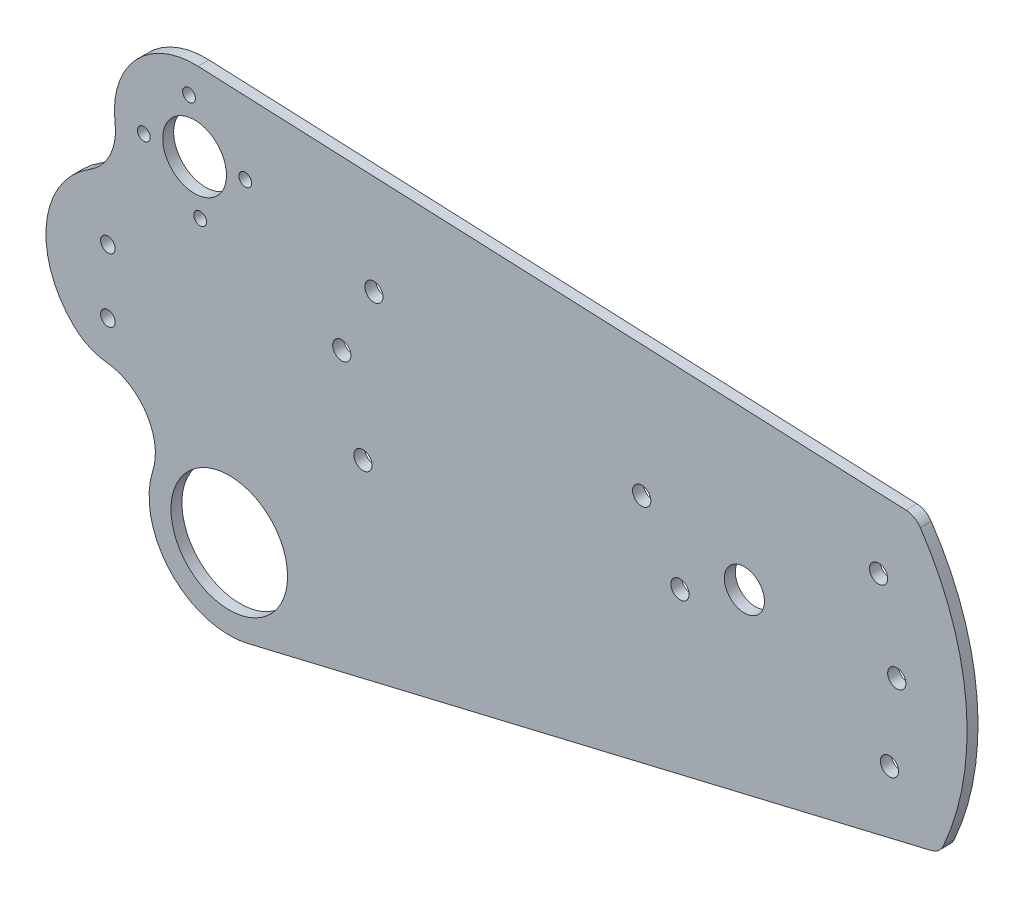
ISO-10303-21;
HEADER;
FILE_DESCRIPTION(('STEP AP214'),'2;1');
FILE_NAME('part.step','',(''),(''),'','','');
FILE_SCHEMA(('AUTOMOTIVE_DESIGN { 1 0 10303 214 1 1 1 1 }'));
ENDSEC;
DATA;
#1=APPLICATION_CONTEXT('core data for automotive mechanical design processes');
#2=APPLICATION_PROTOCOL_DEFINITION('international standard','automotive_design',2000,#1);
#3=PRODUCT_CONTEXT('',#1,'mechanical');
#4=PRODUCT('Part','Part','',(#3));
#5=PRODUCT_RELATED_PRODUCT_CATEGORY('part','',(#4));
#6=PRODUCT_DEFINITION_FORMATION('','',#4);
#7=PRODUCT_DEFINITION_CONTEXT('part definition',#1,'design');
#8=PRODUCT_DEFINITION('design','',#6,#7);
#9=PRODUCT_DEFINITION_SHAPE('','',#8);
#10=(LENGTH_UNIT() NAMED_UNIT(*) SI_UNIT(.MILLI.,.METRE.));
#11=(NAMED_UNIT(*) PLANE_ANGLE_UNIT() SI_UNIT($,.RADIAN.));
#12=(NAMED_UNIT(*) SI_UNIT($,.STERADIAN.) SOLID_ANGLE_UNIT());
#13=UNCERTAINTY_MEASURE_WITH_UNIT(LENGTH_MEASURE(1.E-05),#10,'distance_accuracy_value','');
#14=(GEOMETRIC_REPRESENTATION_CONTEXT(3) GLOBAL_UNCERTAINTY_ASSIGNED_CONTEXT((#13)) GLOBAL_UNIT_ASSIGNED_CONTEXT((#10,
#11,#12)) REPRESENTATION_CONTEXT('',''));
#15=CARTESIAN_POINT('',(0.,0.,0.));
#16=DIRECTION('',(0.,0.,1.));
#17=DIRECTION('',(1.,0.,0.));
#18=AXIS2_PLACEMENT_3D('',#15,#16,#17);
#19=CARTESIAN_POINT('',(1.91215632842237,44.5201547339827,3.));
#20=DIRECTION('',(0.0429107910239942,0.999078907801428,0.));
#21=DIRECTION('',(-0.999078907801428,0.0429107910239942,0.));
#22=AXIS2_PLACEMENT_3D('',#19,#20,#21);
#23=PLANE('',#22);
#24=DIRECTION('',(0.999078907801428,-0.0429107910239942,0.));
#25=VECTOR('',#24,1.);
#26=CARTESIAN_POINT('',(1.91215632842237,44.5201547339827,0.));
#27=LINE('',#26,#25);
#28=CARTESIAN_POINT('',(-113.560266524185,49.4797359716314,0.));
#29=VERTEX_POINT('',#28);
#30=CARTESIAN_POINT('',(80.7215881233943,41.1352618771054,0.));
#31=VERTEX_POINT('',#30);
#32=EDGE_CURVE('E195',#29,#31,#27,.T.);
#33=ORIENTED_EDGE('',*,*,#32,.F.);
#34=DIRECTION('',(0.,0.,-1.));
#35=VECTOR('',#34,1.);
#36=CARTESIAN_POINT('',(-113.560266524185,49.4797359716314,3.));
#37=LINE('',#36,#35);
#38=CARTESIAN_POINT('',(-113.560266524185,49.4797359716314,3.));
#39=VERTEX_POINT('',#38);
#40=EDGE_CURVE('E11',#39,#29,#37,.T.);
#41=ORIENTED_EDGE('',*,*,#40,.F.);
#42=DIRECTION('',(0.999078907801428,-0.0429107910239942,0.));
#43=VECTOR('',#42,1.);
#44=CARTESIAN_POINT('',(1.91215632842237,44.5201547339827,3.));
#45=LINE('',#44,#43);
#46=CARTESIAN_POINT('',(80.7215881233943,41.1352618771054,3.));
#47=VERTEX_POINT('',#46);
#48=EDGE_CURVE('E423',#39,#47,#45,.T.);
#49=ORIENTED_EDGE('',*,*,#48,.T.);
#50=DIRECTION('',(0.,0.,-1.));
#51=VECTOR('',#50,1.);
#52=CARTESIAN_POINT('',(80.7215881233943,41.1352618771054,3.));
#53=LINE('',#52,#51);
#54=EDGE_CURVE('E102',#47,#31,#53,.T.);
#55=ORIENTED_EDGE('',*,*,#54,.T.);
#56=EDGE_LOOP('',(#33,#41,#49,#55));
#57=FACE_BOUND('',#56,.T.);
#58=ADVANCED_FACE('F41',(#57),#23,.T.);
#59=CARTESIAN_POINT('',(-114.504303926713,27.5,3.));
#60=DIRECTION('',(0.,0.,-1.));
#61=DIRECTION('',(-1.,0.,0.));
#62=AXIS2_PLACEMENT_3D('',#59,#60,#61);
#63=CYLINDRICAL_SURFACE('',#62,22.);
#64=CARTESIAN_POINT('',(-114.504303926713,27.5,0.));
#65=DIRECTION('',(0.,0.,1.));
#66=DIRECTION('',(1.,0.,0.));
#67=AXIS2_PLACEMENT_3D('',#64,#65,#66);
#68=CIRCLE('',#67,22.);
#69=CARTESIAN_POINT('',(-136.329525130672,24.732380192604,0.));
#70=VERTEX_POINT('',#69);
#71=EDGE_CURVE('E192',#29,#70,#68,.T.);
#72=ORIENTED_EDGE('',*,*,#71,.T.);
#73=DIRECTION('',(0.,0.,-1.));
#74=VECTOR('',#73,1.);
#75=CARTESIAN_POINT('',(-136.329525130672,24.732380192604,3.));
#76=LINE('',#75,#74);
#77=CARTESIAN_POINT('',(-136.329525130672,24.732380192604,3.));
#78=VERTEX_POINT('',#77);
#79=EDGE_CURVE('E51',#78,#70,#76,.T.);
#80=ORIENTED_EDGE('',*,*,#79,.F.);
#81=CARTESIAN_POINT('',(-114.504303926713,27.5,3.));
#82=DIRECTION('',(0.,0.,1.));
#83=DIRECTION('',(1.,0.,0.));
#84=AXIS2_PLACEMENT_3D('',#81,#82,#83);
#85=CIRCLE('',#84,22.);
#86=EDGE_CURVE('E426',#39,#78,#85,.T.);
#87=ORIENTED_EDGE('',*,*,#86,.F.);
#88=ORIENTED_EDGE('',*,*,#40,.T.);
#89=EDGE_LOOP('',(#72,#80,#87,#88));
#90=FACE_BOUND('',#89,.T.);
#91=ADVANCED_FACE('F193',(#90),#63,.T.);
#92=CARTESIAN_POINT('',(-151.210357769734,22.8453666875613,3.));
#93=DIRECTION('',(0.,0.,-1.));
#94=DIRECTION('',(-1.,0.,0.));
#95=AXIS2_PLACEMENT_3D('',#92,#93,#94);
#96=CYLINDRICAL_SURFACE('',#95,15.);
#97=CARTESIAN_POINT('',(-151.210357769734,22.8453666875613,0.));
#98=DIRECTION('',(0.,0.,1.));
#99=DIRECTION('',(1.,0.,0.));
#100=AXIS2_PLACEMENT_3D('',#97,#98,#99);
#101=CIRCLE('',#100,15.);
#102=CARTESIAN_POINT('',(-143.370984404331,10.0569256082972,0.));
#103=VERTEX_POINT('',#102);
#104=EDGE_CURVE('E187',#103,#70,#101,.T.);
#105=ORIENTED_EDGE('',*,*,#104,.F.);
#106=DIRECTION('',(0.,0.,-1.));
#107=VECTOR('',#106,1.);
#108=CARTESIAN_POINT('',(-143.370984404331,10.0569256082972,3.));
#109=LINE('',#108,#107);
#110=CARTESIAN_POINT('',(-143.370984404331,10.0569256082972,3.));
#111=VERTEX_POINT('',#110);
#112=EDGE_CURVE('E177',#111,#103,#109,.T.);
#113=ORIENTED_EDGE('',*,*,#112,.F.);
#114=CARTESIAN_POINT('',(-151.210357769734,22.8453666875613,3.));
#115=DIRECTION('',(0.,0.,1.));
#116=DIRECTION('',(1.,0.,0.));
#117=AXIS2_PLACEMENT_3D('',#114,#115,#116);
#118=CIRCLE('',#117,15.);
#119=EDGE_CURVE('E189',#111,#78,#118,.T.);
#120=ORIENTED_EDGE('',*,*,#119,.T.);
#121=ORIENTED_EDGE('',*,*,#79,.T.);
#122=EDGE_LOOP('',(#105,#113,#120,#121));
#123=FACE_BOUND('',#122,.T.);
#124=ADVANCED_FACE('F185',(#123),#96,.F.);
#125=CARTESIAN_POINT('',(-130.305362128659,-11.2571428571429,3.));
#126=DIRECTION('',(0.,0.,-1.));
#127=DIRECTION('',(-1.,0.,0.));
#128=AXIS2_PLACEMENT_3D('',#125,#126,#127);
#129=CYLINDRICAL_SURFACE('',#128,25.);
#130=CARTESIAN_POINT('',(-130.305362128659,-11.2571428571429,0.));
#131=DIRECTION('',(0.,0.,1.));
#132=DIRECTION('',(1.,0.,0.));
#133=AXIS2_PLACEMENT_3D('',#130,#131,#132);
#134=CIRCLE('',#133,25.);
#135=CARTESIAN_POINT('',(-147.542861296201,-29.3642857142857,0.));
#136=VERTEX_POINT('',#135);
#137=EDGE_CURVE('E201',#103,#136,#134,.T.);
#138=ORIENTED_EDGE('',*,*,#137,.T.);
#139=DIRECTION('',(0.,0.,-1.));
#140=VECTOR('',#139,1.);
#141=CARTESIAN_POINT('',(-147.542861296201,-29.3642857142857,3.));
#142=LINE('',#141,#140);
#143=CARTESIAN_POINT('',(-147.542861296201,-29.3642857142857,3.));
#144=VERTEX_POINT('',#143);
#145=EDGE_CURVE('E173',#144,#136,#142,.T.);
#146=ORIENTED_EDGE('',*,*,#145,.F.);
#147=CARTESIAN_POINT('',(-130.305362128659,-11.2571428571429,3.));
#148=DIRECTION('',(0.,0.,1.));
#149=DIRECTION('',(1.,0.,0.));
#150=AXIS2_PLACEMENT_3D('',#147,#148,#149);
#151=CIRCLE('',#150,25.);
#152=EDGE_CURVE('E433',#111,#144,#151,.T.);
#153=ORIENTED_EDGE('',*,*,#152,.F.);
#154=ORIENTED_EDGE('',*,*,#112,.T.);
#155=EDGE_LOOP('',(#138,#146,#153,#154));
#156=FACE_BOUND('',#155,.T.);
#157=ADVANCED_FACE('F321',(#156),#129,.T.);
#158=CARTESIAN_POINT('',(-137.200361795676,-18.5,3.));
#159=DIRECTION('',(0.,0.,-1.));
#160=DIRECTION('',(-1.,0.,0.));
#161=AXIS2_PLACEMENT_3D('',#158,#159,#160);
#162=CYLINDRICAL_SURFACE('',#161,15.);
#163=CARTESIAN_POINT('',(-137.200361795676,-18.5,0.));
#164=DIRECTION('',(0.,0.,1.));
#165=DIRECTION('',(1.,0.,0.));
#166=AXIS2_PLACEMENT_3D('',#163,#164,#165);
#167=CIRCLE('',#166,15.);
#168=CARTESIAN_POINT('',(-138.735140925498,-33.4212751808505,0.));
#169=VERTEX_POINT('',#168);
#170=EDGE_CURVE('E205',#136,#169,#167,.T.);
#171=ORIENTED_EDGE('',*,*,#170,.T.);
#172=DIRECTION('',(0.,0.,-1.));
#173=VECTOR('',#172,1.);
#174=CARTESIAN_POINT('',(-138.735140925498,-33.4212751808505,3.));
#175=LINE('',#174,#173);
#176=CARTESIAN_POINT('',(-138.735140925498,-33.4212751808505,3.));
#177=VERTEX_POINT('',#176);
#178=EDGE_CURVE('E170',#177,#169,#175,.T.);
#179=ORIENTED_EDGE('',*,*,#178,.F.);
#180=CARTESIAN_POINT('',(-137.200361795676,-18.5,3.));
#181=DIRECTION('',(0.,0.,1.));
#182=DIRECTION('',(1.,0.,0.));
#183=AXIS2_PLACEMENT_3D('',#180,#181,#182);
#184=CIRCLE('',#183,15.);
#185=EDGE_CURVE('E437',#144,#177,#184,.T.);
#186=ORIENTED_EDGE('',*,*,#185,.F.);
#187=ORIENTED_EDGE('',*,*,#145,.T.);
#188=EDGE_LOOP('',(#171,#179,#186,#187));
#189=FACE_BOUND('',#188,.T.);
#190=ADVANCED_FACE('F324',(#189),#162,.T.);
#191=CARTESIAN_POINT('',(-140.26992005532,-48.3425503617009,3.));
#192=DIRECTION('',(0.,0.,-1.));
#193=DIRECTION('',(-1.,0.,0.));
#194=AXIS2_PLACEMENT_3D('',#191,#192,#193);
#195=CYLINDRICAL_SURFACE('',#194,15.);
#196=CARTESIAN_POINT('',(-140.26992005532,-48.3425503617009,0.));
#197=DIRECTION('',(0.,0.,1.));
#198=DIRECTION('',(1.,0.,0.));
#199=AXIS2_PLACEMENT_3D('',#196,#197,#198);
#200=CIRCLE('',#199,15.);
#201=CARTESIAN_POINT('',(-125.965715233565,-52.8580486085475,0.));
#202=VERTEX_POINT('',#201);
#203=EDGE_CURVE('E212',#202,#169,#200,.T.);
#204=ORIENTED_EDGE('',*,*,#203,.F.);
#205=DIRECTION('',(0.,0.,-1.));
#206=VECTOR('',#205,1.);
#207=CARTESIAN_POINT('',(-125.965715233565,-52.8580486085475,3.));
#208=LINE('',#207,#206);
#209=CARTESIAN_POINT('',(-125.965715233565,-52.8580486085475,3.));
#210=VERTEX_POINT('',#209);
#211=EDGE_CURVE('E167',#210,#202,#208,.T.);
#212=ORIENTED_EDGE('',*,*,#211,.F.);
#213=CARTESIAN_POINT('',(-140.26992005532,-48.3425503617009,3.));
#214=DIRECTION('',(0.,0.,1.));
#215=DIRECTION('',(1.,0.,0.));
#216=AXIS2_PLACEMENT_3D('',#213,#214,#215);
#217=CIRCLE('',#216,15.);
#218=EDGE_CURVE('E440',#210,#177,#217,.T.);
#219=ORIENTED_EDGE('',*,*,#218,.T.);
#220=ORIENTED_EDGE('',*,*,#178,.T.);
#221=EDGE_LOOP('',(#204,#212,#219,#220));
#222=FACE_BOUND('',#221,.T.);
#223=ADVANCED_FACE('F328',(#222),#195,.F.);
#224=CARTESIAN_POINT('',(-104.986214828324,-59.4807793705892,3.));
#225=DIRECTION('',(0.,0.,-1.));
#226=DIRECTION('',(-1.,0.,0.));
#227=AXIS2_PLACEMENT_3D('',#224,#225,#226);
#228=CYLINDRICAL_SURFACE('',#227,22.);
#229=CARTESIAN_POINT('',(-104.986214828324,-59.4807793705892,0.));
#230=DIRECTION('',(0.,0.,1.));
#231=DIRECTION('',(1.,0.,0.));
#232=AXIS2_PLACEMENT_3D('',#229,#230,#231);
#233=CIRCLE('',#232,22.);
#234=CARTESIAN_POINT('',(-99.8994420943231,-80.8846281635664,0.));
#235=VERTEX_POINT('',#234);
#236=EDGE_CURVE('E216',#202,#235,#233,.T.);
#237=ORIENTED_EDGE('',*,*,#236,.T.);
#238=DIRECTION('',(0.,0.,-1.));
#239=VECTOR('',#238,1.);
#240=CARTESIAN_POINT('',(-99.8994420943231,-80.8846281635664,3.));
#241=LINE('',#240,#239);
#242=CARTESIAN_POINT('',(-99.8994420943231,-80.8846281635664,3.));
#243=VERTEX_POINT('',#242);
#244=EDGE_CURVE('E159',#243,#235,#241,.T.);
#245=ORIENTED_EDGE('',*,*,#244,.F.);
#246=CARTESIAN_POINT('',(-104.986214828324,-59.4807793705892,3.));
#247=DIRECTION('',(0.,0.,1.));
#248=DIRECTION('',(1.,0.,0.));
#249=AXIS2_PLACEMENT_3D('',#246,#247,#248);
#250=CIRCLE('',#249,22.);
#251=EDGE_CURVE('E444',#210,#243,#250,.T.);
#252=ORIENTED_EDGE('',*,*,#251,.F.);
#253=ORIENTED_EDGE('',*,*,#211,.T.);
#254=EDGE_LOOP('',(#237,#245,#252,#253));
#255=FACE_BOUND('',#254,.T.);
#256=ADVANCED_FACE('F332',(#255),#228,.T.);
#257=CARTESIAN_POINT('',(12.8543650069219,-54.0879058934321,3.));
#258=DIRECTION('',(-0.231216942454566,0.972902217862598,0.));
#259=DIRECTION('',(-0.972902217862598,-0.231216942454566,0.));
#260=AXIS2_PLACEMENT_3D('',#257,#258,#259);
#261=PLANE('',#260);
#262=DIRECTION('',(0.972902217862598,0.231216942454566,0.));
#263=VECTOR('',#262,1.);
#264=CARTESIAN_POINT('',(12.8543650069219,-54.0879058934321,0.));
#265=LINE('',#264,#263);
#266=CARTESIAN_POINT('',(87.5903381718725,-36.3263848594582,0.));
#267=VERTEX_POINT('',#266);
#268=EDGE_CURVE('E220',#235,#267,#265,.T.);
#269=ORIENTED_EDGE('',*,*,#268,.T.);
#270=DIRECTION('',(0.,0.,-1.));
#271=VECTOR('',#270,1.);
#272=CARTESIAN_POINT('',(87.5903381718725,-36.3263848594582,3.));
#273=LINE('',#272,#271);
#274=CARTESIAN_POINT('',(87.5903381718725,-36.3263848594582,3.));
#275=VERTEX_POINT('',#274);
#276=EDGE_CURVE('E155',#275,#267,#273,.T.);
#277=ORIENTED_EDGE('',*,*,#276,.F.);
#278=DIRECTION('',(0.972902217862598,0.231216942454566,0.));
#279=VECTOR('',#278,1.);
#280=CARTESIAN_POINT('',(12.8543650069219,-54.0879058934321,3.));
#281=LINE('',#280,#279);
#282=EDGE_CURVE('E146',#243,#275,#281,.T.);
#283=ORIENTED_EDGE('',*,*,#282,.F.);
#284=ORIENTED_EDGE('',*,*,#244,.T.);
#285=EDGE_LOOP('',(#269,#277,#283,#284));
#286=FACE_BOUND('',#285,.T.);
#287=ADVANCED_FACE('F336',(#286),#261,.F.);
#288=CARTESIAN_POINT('',(86.4342534595996,-31.4618737701452,3.));
#289=DIRECTION('',(0.,0.,-1.));
#290=DIRECTION('',(-1.,0.,0.));
#291=AXIS2_PLACEMENT_3D('',#288,#289,#290);
#292=CYLINDRICAL_SURFACE('',#291,5.00000000000001);
#293=CARTESIAN_POINT('',(86.4342534595996,-31.4618737701452,0.));
#294=DIRECTION('',(0.,0.,1.));
#295=DIRECTION('',(1.,0.,0.));
#296=AXIS2_PLACEMENT_3D('',#293,#294,#295);
#297=CIRCLE('',#296,5.00000000000001);
#298=CARTESIAN_POINT('',(91.,-33.5,0.));
#299=VERTEX_POINT('',#298);
#300=EDGE_CURVE('E153',#267,#299,#297,.T.);
#301=ORIENTED_EDGE('',*,*,#300,.T.);
#302=DIRECTION('',(0.,0.,-1.));
#303=VECTOR('',#302,1.);
#304=CARTESIAN_POINT('',(91.,-33.5,3.));
#305=LINE('',#304,#303);
#306=CARTESIAN_POINT('',(91.,-33.5,3.));
#307=VERTEX_POINT('',#306);
#308=EDGE_CURVE('E136',#307,#299,#305,.T.);
#309=ORIENTED_EDGE('',*,*,#308,.F.);
#310=CARTESIAN_POINT('',(86.4342534595996,-31.4618737701452,3.));
#311=DIRECTION('',(0.,0.,1.));
#312=DIRECTION('',(1.,0.,0.));
#313=AXIS2_PLACEMENT_3D('',#310,#311,#312);
#314=CIRCLE('',#313,5.00000000000001);
#315=EDGE_CURVE('E140',#275,#307,#314,.T.);
#316=ORIENTED_EDGE('',*,*,#315,.F.);
#317=ORIENTED_EDGE('',*,*,#276,.T.);
#318=EDGE_LOOP('',(#301,#309,#316,#317));
#319=FACE_BOUND('',#318,.T.);
#320=ADVANCED_FACE('F152',(#319),#292,.T.);
#321=CARTESIAN_POINT('',(22.6589151875398,-2.99288439458776,3.));
#322=DIRECTION('',(0.,0.,-1.));
#323=DIRECTION('',(-1.,0.,0.));
#324=AXIS2_PLACEMENT_3D('',#321,#322,#323);
#325=CYLINDRICAL_SURFACE('',#324,74.8410848124603);
#326=CARTESIAN_POINT('',(22.6589151875398,-2.99288439458776,0.));
#327=DIRECTION('',(0.,0.,1.));
#328=DIRECTION('',(1.,0.,0.));
#329=AXIS2_PLACEMENT_3D('',#326,#327,#328);
#330=CIRCLE('',#329,74.8410848124603);
#331=CARTESIAN_POINT('',(84.648444567044,38.9414240319674,0.));
#332=VERTEX_POINT('',#331);
#333=EDGE_CURVE('E226',#299,#332,#330,.T.);
#334=ORIENTED_EDGE('',*,*,#333,.T.);
#335=DIRECTION('',(0.,0.,-1.));
#336=VECTOR('',#335,1.);
#337=CARTESIAN_POINT('',(84.648444567044,38.9414240319674,3.));
#338=LINE('',#337,#336);
#339=CARTESIAN_POINT('',(84.648444567044,38.9414240319674,3.));
#340=VERTEX_POINT('',#339);
#341=EDGE_CURVE('E138',#340,#332,#338,.T.);
#342=ORIENTED_EDGE('',*,*,#341,.F.);
#343=CARTESIAN_POINT('',(22.6589151875398,-2.99288439458776,3.));
#344=DIRECTION('',(0.,0.,1.));
#345=DIRECTION('',(1.,0.,0.));
#346=AXIS2_PLACEMENT_3D('',#343,#344,#345);
#347=CIRCLE('',#346,74.8410848124603);
#348=EDGE_CURVE('E131',#307,#340,#347,.T.);
#349=ORIENTED_EDGE('',*,*,#348,.F.);
#350=ORIENTED_EDGE('',*,*,#308,.T.);
#351=EDGE_LOOP('',(#334,#342,#349,#350));
#352=FACE_BOUND('',#351,.T.);
#353=ADVANCED_FACE('F134',(#352),#325,.T.);
#354=CARTESIAN_POINT('',(-100.587379227419,29.0228942557423,3.));
#355=DIRECTION('',(0.,0.,-1.));
#356=DIRECTION('',(-1.,0.,0.));
#357=AXIS2_PLACEMENT_3D('',#354,#355,#356);
#358=CYLINDRICAL_SURFACE('',#357,1.74999999999997);
#359=CARTESIAN_POINT('',(-100.587379227419,29.0228942557423,3.));
#360=DIRECTION('',(0.,0.,1.));
#361=DIRECTION('',(1.,0.,0.));
#362=AXIS2_PLACEMENT_3D('',#359,#360,#361);
#363=CIRCLE('',#362,1.74999999999997);
#364=CARTESIAN_POINT('',(-98.8373792274191,29.0228942557423,3.));
#365=VERTEX_POINT('',#364);
#366=EDGE_CURVE('E299',#365,#365,#363,.T.);
#367=ORIENTED_EDGE('',*,*,#366,.T.);
#368=EDGE_LOOP('',(#367));
#369=FACE_BOUND('',#368,.T.);
#370=CARTESIAN_POINT('',(-100.587379227419,29.0228942557423,0.));
#371=DIRECTION('',(0.,0.,1.));
#372=DIRECTION('',(1.,0.,0.));
#373=AXIS2_PLACEMENT_3D('',#370,#371,#372);
#374=CIRCLE('',#373,1.74999999999997);
#375=CARTESIAN_POINT('',(-98.8373792274191,29.0228942557423,0.));
#376=VERTEX_POINT('',#375);
#377=EDGE_CURVE('E287',#376,#376,#374,.T.);
#378=ORIENTED_EDGE('',*,*,#377,.F.);
#379=EDGE_LOOP('',(#378));
#380=FACE_BOUND('',#379,.T.);
#381=ADVANCED_FACE('F345',(#369,#380),#358,.F.);
#382=CARTESIAN_POINT('',(-112.981409670971,13.5830753007057,3.));
#383=DIRECTION('',(0.,0.,-1.));
#384=DIRECTION('',(-1.,0.,0.));
#385=AXIS2_PLACEMENT_3D('',#382,#383,#384);
#386=CYLINDRICAL_SURFACE('',#385,1.74999999999997);
#387=CARTESIAN_POINT('',(-112.981409670971,13.5830753007057,3.));
#388=DIRECTION('',(0.,0.,1.));
#389=DIRECTION('',(1.,0.,0.));
#390=AXIS2_PLACEMENT_3D('',#387,#388,#389);
#391=CIRCLE('',#390,1.74999999999997);
#392=CARTESIAN_POINT('',(-111.231409670971,13.5830753007057,3.));
#393=VERTEX_POINT('',#392);
#394=EDGE_CURVE('E305',#393,#393,#391,.T.);
#395=ORIENTED_EDGE('',*,*,#394,.T.);
#396=EDGE_LOOP('',(#395));
#397=FACE_BOUND('',#396,.T.);
#398=CARTESIAN_POINT('',(-112.981409670971,13.5830753007057,0.));
#399=DIRECTION('',(0.,0.,1.));
#400=DIRECTION('',(1.,0.,0.));
#401=AXIS2_PLACEMENT_3D('',#398,#399,#400);
#402=CIRCLE('',#401,1.74999999999997);
#403=CARTESIAN_POINT('',(-111.231409670971,13.5830753007057,0.));
#404=VERTEX_POINT('',#403);
#405=EDGE_CURVE('E283',#404,#404,#402,.T.);
#406=ORIENTED_EDGE('',*,*,#405,.F.);
#407=EDGE_LOOP('',(#406));
#408=FACE_BOUND('',#407,.T.);
#409=ADVANCED_FACE('F401',(#397,#408),#386,.F.);
#410=CARTESIAN_POINT('',(-128.421228626008,25.9771057442576,3.));
#411=DIRECTION('',(0.,0.,-1.));
#412=DIRECTION('',(-1.,0.,0.));
#413=AXIS2_PLACEMENT_3D('',#410,#411,#412);
#414=CYLINDRICAL_SURFACE('',#413,1.74999999999998);
#415=CARTESIAN_POINT('',(-128.421228626008,25.9771057442576,3.));
#416=DIRECTION('',(0.,0.,1.));
#417=DIRECTION('',(1.,0.,0.));
#418=AXIS2_PLACEMENT_3D('',#415,#416,#417);
#419=CIRCLE('',#418,1.74999999999998);
#420=CARTESIAN_POINT('',(-126.671228626008,25.9771057442576,3.));
#421=VERTEX_POINT('',#420);
#422=EDGE_CURVE('E499',#421,#421,#419,.T.);
#423=ORIENTED_EDGE('',*,*,#422,.T.);
#424=EDGE_LOOP('',(#423));
#425=FACE_BOUND('',#424,.T.);
#426=CARTESIAN_POINT('',(-128.421228626008,25.9771057442576,0.));
#427=DIRECTION('',(0.,0.,1.));
#428=DIRECTION('',(1.,0.,0.));
#429=AXIS2_PLACEMENT_3D('',#426,#427,#428);
#430=CIRCLE('',#429,1.74999999999998);
#431=CARTESIAN_POINT('',(-126.671228626008,25.9771057442576,0.));
#432=VERTEX_POINT('',#431);
#433=EDGE_CURVE('E279',#432,#432,#430,.T.);
#434=ORIENTED_EDGE('',*,*,#433,.F.);
#435=EDGE_LOOP('',(#434));
#436=FACE_BOUND('',#435,.T.);
#437=ADVANCED_FACE('F397',(#425,#436),#414,.F.);
#438=CARTESIAN_POINT('',(-114.504303926713,27.5,3.));
#439=DIRECTION('',(0.,0.,-1.));
#440=DIRECTION('',(-1.,0.,0.));
#441=AXIS2_PLACEMENT_3D('',#438,#439,#440);
#442=CYLINDRICAL_SURFACE('',#441,8.75);
#443=CARTESIAN_POINT('',(-114.504303926713,27.5,3.));
#444=DIRECTION('',(0.,0.,1.));
#445=DIRECTION('',(1.,0.,0.));
#446=AXIS2_PLACEMENT_3D('',#443,#444,#445);
#447=CIRCLE('',#446,8.75);
#448=CARTESIAN_POINT('',(-105.754303926713,27.5,3.));
#449=VERTEX_POINT('',#448);
#450=EDGE_CURVE('E495',#449,#449,#447,.T.);
#451=ORIENTED_EDGE('',*,*,#450,.T.);
#452=EDGE_LOOP('',(#451));
#453=FACE_BOUND('',#452,.T.);
#454=CARTESIAN_POINT('',(-114.504303926713,27.5,0.));
#455=DIRECTION('',(0.,0.,1.));
#456=DIRECTION('',(1.,0.,0.));
#457=AXIS2_PLACEMENT_3D('',#454,#455,#456);
#458=CIRCLE('',#457,8.75);
#459=CARTESIAN_POINT('',(-105.754303926713,27.5,0.));
#460=VERTEX_POINT('',#459);
#461=EDGE_CURVE('E275',#460,#460,#458,.T.);
#462=ORIENTED_EDGE('',*,*,#461,.F.);
#463=EDGE_LOOP('',(#462));
#464=FACE_BOUND('',#463,.T.);
#465=ADVANCED_FACE('F393',(#453,#464),#442,.F.);
#466=CARTESIAN_POINT('',(-104.986214828324,-59.4807793705892,3.));
#467=DIRECTION('',(0.,0.,-1.));
#468=DIRECTION('',(-1.,0.,0.));
#469=AXIS2_PLACEMENT_3D('',#466,#467,#468);
#470=CYLINDRICAL_SURFACE('',#469,16.);
#471=CARTESIAN_POINT('',(-104.986214828324,-59.4807793705892,3.));
#472=DIRECTION('',(0.,0.,1.));
#473=DIRECTION('',(1.,0.,0.));
#474=AXIS2_PLACEMENT_3D('',#471,#472,#473);
#475=CIRCLE('',#474,16.);
#476=CARTESIAN_POINT('',(-88.9862148283235,-59.4807793705892,3.));
#477=VERTEX_POINT('',#476);
#478=EDGE_CURVE('E491',#477,#477,#475,.T.);
#479=ORIENTED_EDGE('',*,*,#478,.T.);
#480=EDGE_LOOP('',(#479));
#481=FACE_BOUND('',#480,.T.);
#482=CARTESIAN_POINT('',(-104.986214828324,-59.4807793705892,0.));
#483=DIRECTION('',(0.,0.,1.));
#484=DIRECTION('',(1.,0.,0.));
#485=AXIS2_PLACEMENT_3D('',#482,#483,#484);
#486=CIRCLE('',#485,16.);
#487=CARTESIAN_POINT('',(-88.9862148283235,-59.4807793705892,0.));
#488=VERTEX_POINT('',#487);
#489=EDGE_CURVE('E271',#488,#488,#486,.T.);
#490=ORIENTED_EDGE('',*,*,#489,.F.);
#491=EDGE_LOOP('',(#490));
#492=FACE_BOUND('',#491,.T.);
#493=ADVANCED_FACE('F389',(#481,#492),#470,.F.);
#494=CARTESIAN_POINT('',(-68.3,-21.5,3.));
#495=DIRECTION('',(0.,0.,-1.));
#496=DIRECTION('',(-1.,0.,0.));
#497=AXIS2_PLACEMENT_3D('',#494,#495,#496);
#498=CYLINDRICAL_SURFACE('',#497,2.49999999999999);
#499=CARTESIAN_POINT('',(-68.3,-21.5,3.));
#500=DIRECTION('',(0.,0.,1.));
#501=DIRECTION('',(1.,0.,0.));
#502=AXIS2_PLACEMENT_3D('',#499,#500,#501);
#503=CIRCLE('',#502,2.49999999999999);
#504=CARTESIAN_POINT('',(-65.8,-21.5,3.));
#505=VERTEX_POINT('',#504);
#506=EDGE_CURVE('E487',#505,#505,#503,.T.);
#507=ORIENTED_EDGE('',*,*,#506,.T.);
#508=EDGE_LOOP('',(#507));
#509=FACE_BOUND('',#508,.T.);
#510=CARTESIAN_POINT('',(-68.3,-21.5,0.));
#511=DIRECTION('',(0.,0.,1.));
#512=DIRECTION('',(1.,0.,0.));
#513=AXIS2_PLACEMENT_3D('',#510,#511,#512);
#514=CIRCLE('',#513,2.49999999999999);
#515=CARTESIAN_POINT('',(-65.8,-21.5,0.));
#516=VERTEX_POINT('',#515);
#517=EDGE_CURVE('E267',#516,#516,#514,.T.);
#518=ORIENTED_EDGE('',*,*,#517,.F.);
#519=EDGE_LOOP('',(#518));
#520=FACE_BOUND('',#519,.T.);
#521=ADVANCED_FACE('F385',(#509,#520),#498,.F.);
#522=CARTESIAN_POINT('',(-138.3,-5.25000000000004,3.));
#523=DIRECTION('',(0.,0.,-1.));
#524=DIRECTION('',(-1.,0.,0.));
#525=AXIS2_PLACEMENT_3D('',#522,#523,#524);
#526=CYLINDRICAL_SURFACE('',#525,2.);
#527=CARTESIAN_POINT('',(-138.3,-5.25000000000004,3.));
#528=DIRECTION('',(0.,0.,1.));
#529=DIRECTION('',(1.,0.,0.));
#530=AXIS2_PLACEMENT_3D('',#527,#528,#529);
#531=CIRCLE('',#530,2.);
#532=CARTESIAN_POINT('',(-136.3,-5.25000000000004,3.));
#533=VERTEX_POINT('',#532);
#534=EDGE_CURVE('E483',#533,#533,#531,.T.);
#535=ORIENTED_EDGE('',*,*,#534,.T.);
#536=EDGE_LOOP('',(#535));
#537=FACE_BOUND('',#536,.T.);
#538=CARTESIAN_POINT('',(-138.3,-5.25000000000004,0.));
#539=DIRECTION('',(0.,0.,1.));
#540=DIRECTION('',(1.,0.,0.));
#541=AXIS2_PLACEMENT_3D('',#538,#539,#540);
#542=CIRCLE('',#541,2.);
#543=CARTESIAN_POINT('',(-136.3,-5.25000000000004,0.));
#544=VERTEX_POINT('',#543);
#545=EDGE_CURVE('E263',#544,#544,#542,.T.);
#546=ORIENTED_EDGE('',*,*,#545,.F.);
#547=EDGE_LOOP('',(#546));
#548=FACE_BOUND('',#547,.T.);
#549=ADVANCED_FACE('F381',(#537,#548),#526,.F.);
#550=CARTESIAN_POINT('',(-138.3,-22.75,3.));
#551=DIRECTION('',(0.,0.,-1.));
#552=DIRECTION('',(-1.,0.,0.));
#553=AXIS2_PLACEMENT_3D('',#550,#551,#552);
#554=CYLINDRICAL_SURFACE('',#553,2.);
#555=CARTESIAN_POINT('',(-138.3,-22.75,3.));
#556=DIRECTION('',(0.,0.,1.));
#557=DIRECTION('',(1.,0.,0.));
#558=AXIS2_PLACEMENT_3D('',#555,#556,#557);
#559=CIRCLE('',#558,2.);
#560=CARTESIAN_POINT('',(-136.3,-22.75,3.));
#561=VERTEX_POINT('',#560);
#562=EDGE_CURVE('E479',#561,#561,#559,.T.);
#563=ORIENTED_EDGE('',*,*,#562,.T.);
#564=EDGE_LOOP('',(#563));
#565=FACE_BOUND('',#564,.T.);
#566=CARTESIAN_POINT('',(-138.3,-22.75,0.));
#567=DIRECTION('',(0.,0.,1.));
#568=DIRECTION('',(1.,0.,0.));
#569=AXIS2_PLACEMENT_3D('',#566,#567,#568);
#570=CIRCLE('',#569,2.);
#571=CARTESIAN_POINT('',(-136.3,-22.75,0.));
#572=VERTEX_POINT('',#571);
#573=EDGE_CURVE('E259',#572,#572,#570,.T.);
#574=ORIENTED_EDGE('',*,*,#573,.F.);
#575=EDGE_LOOP('',(#574));
#576=FACE_BOUND('',#575,.T.);
#577=ADVANCED_FACE('F377',(#565,#576),#554,.F.);
#578=CARTESIAN_POINT('',(-74.1,1.7,3.));
#579=DIRECTION('',(0.,0.,-1.));
#580=DIRECTION('',(-1.,0.,0.));
#581=AXIS2_PLACEMENT_3D('',#578,#579,#580);
#582=CYLINDRICAL_SURFACE('',#581,2.49999999999999);
#583=CARTESIAN_POINT('',(-74.1,1.7,3.));
#584=DIRECTION('',(0.,0.,1.));
#585=DIRECTION('',(1.,0.,0.));
#586=AXIS2_PLACEMENT_3D('',#583,#584,#585);
#587=CIRCLE('',#586,2.49999999999999);
#588=CARTESIAN_POINT('',(-71.6,1.7,3.));
#589=VERTEX_POINT('',#588);
#590=EDGE_CURVE('E475',#589,#589,#587,.T.);
#591=ORIENTED_EDGE('',*,*,#590,.T.);
#592=EDGE_LOOP('',(#591));
#593=FACE_BOUND('',#592,.T.);
#594=CARTESIAN_POINT('',(-74.1,1.7,0.));
#595=DIRECTION('',(0.,0.,1.));
#596=DIRECTION('',(1.,0.,0.));
#597=AXIS2_PLACEMENT_3D('',#594,#595,#596);
#598=CIRCLE('',#597,2.49999999999999);
#599=CARTESIAN_POINT('',(-71.6,1.7,0.));
#600=VERTEX_POINT('',#599);
#601=EDGE_CURVE('E255',#600,#600,#598,.T.);
#602=ORIENTED_EDGE('',*,*,#601,.F.);
#603=EDGE_LOOP('',(#602));
#604=FACE_BOUND('',#603,.T.);
#605=ADVANCED_FACE('F373',(#593,#604),#582,.F.);
#606=CARTESIAN_POINT('',(-65.3,20.,3.));
#607=DIRECTION('',(0.,0.,-1.));
#608=DIRECTION('',(-1.,0.,0.));
#609=AXIS2_PLACEMENT_3D('',#606,#607,#608);
#610=CYLINDRICAL_SURFACE('',#609,2.50000000000001);
#611=CARTESIAN_POINT('',(-65.3,20.,3.));
#612=DIRECTION('',(0.,0.,1.));
#613=DIRECTION('',(1.,0.,0.));
#614=AXIS2_PLACEMENT_3D('',#611,#612,#613);
#615=CIRCLE('',#614,2.50000000000001);
#616=CARTESIAN_POINT('',(-62.8,20.,3.));
#617=VERTEX_POINT('',#616);
#618=EDGE_CURVE('E471',#617,#617,#615,.T.);
#619=ORIENTED_EDGE('',*,*,#618,.T.);
#620=EDGE_LOOP('',(#619));
#621=FACE_BOUND('',#620,.T.);
#622=CARTESIAN_POINT('',(-65.3,20.,0.));
#623=DIRECTION('',(0.,0.,1.));
#624=DIRECTION('',(1.,0.,0.));
#625=AXIS2_PLACEMENT_3D('',#622,#623,#624);
#626=CIRCLE('',#625,2.50000000000001);
#627=CARTESIAN_POINT('',(-62.8,20.,0.));
#628=VERTEX_POINT('',#627);
#629=EDGE_CURVE('E251',#628,#628,#626,.T.);
#630=ORIENTED_EDGE('',*,*,#629,.F.);
#631=EDGE_LOOP('',(#630));
#632=FACE_BOUND('',#631,.T.);
#633=ADVANCED_FACE('F369',(#621,#632),#610,.F.);
#634=CARTESIAN_POINT('',(78.2,-0.100000000000003,3.));
#635=DIRECTION('',(0.,0.,-1.));
#636=DIRECTION('',(-1.,0.,0.));
#637=AXIS2_PLACEMENT_3D('',#634,#635,#636);
#638=CYLINDRICAL_SURFACE('',#637,2.5);
#639=CARTESIAN_POINT('',(78.2,-0.100000000000003,3.));
#640=DIRECTION('',(0.,0.,1.));
#641=DIRECTION('',(1.,0.,0.));
#642=AXIS2_PLACEMENT_3D('',#639,#640,#641);
#643=CIRCLE('',#642,2.5);
#644=CARTESIAN_POINT('',(80.7,-0.100000000000003,3.));
#645=VERTEX_POINT('',#644);
#646=EDGE_CURVE('E467',#645,#645,#643,.T.);
#647=ORIENTED_EDGE('',*,*,#646,.T.);
#648=EDGE_LOOP('',(#647));
#649=FACE_BOUND('',#648,.T.);
#650=CARTESIAN_POINT('',(78.2,-0.100000000000003,0.));
#651=DIRECTION('',(0.,0.,1.));
#652=DIRECTION('',(1.,0.,0.));
#653=AXIS2_PLACEMENT_3D('',#650,#651,#652);
#654=CIRCLE('',#653,2.5);
#655=CARTESIAN_POINT('',(80.7,-0.100000000000003,0.));
#656=VERTEX_POINT('',#655);
#657=EDGE_CURVE('E247',#656,#656,#654,.T.);
#658=ORIENTED_EDGE('',*,*,#657,.F.);
#659=EDGE_LOOP('',(#658));
#660=FACE_BOUND('',#659,.T.);
#661=ADVANCED_FACE('F365',(#649,#660),#638,.F.);
#662=CARTESIAN_POINT('',(18.7,-8.7,3.));
#663=DIRECTION('',(0.,0.,-1.));
#664=DIRECTION('',(-1.,0.,0.));
#665=AXIS2_PLACEMENT_3D('',#662,#663,#664);
#666=CYLINDRICAL_SURFACE('',#665,2.5);
#667=CARTESIAN_POINT('',(18.7,-8.7,3.));
#668=DIRECTION('',(0.,0.,1.));
#669=DIRECTION('',(1.,0.,0.));
#670=AXIS2_PLACEMENT_3D('',#667,#668,#669);
#671=CIRCLE('',#670,2.5);
#672=CARTESIAN_POINT('',(21.2,-8.7,3.));
#673=VERTEX_POINT('',#672);
#674=EDGE_CURVE('E463',#673,#673,#671,.T.);
#675=ORIENTED_EDGE('',*,*,#674,.T.);
#676=EDGE_LOOP('',(#675));
#677=FACE_BOUND('',#676,.T.);
#678=CARTESIAN_POINT('',(18.7,-8.7,0.));
#679=DIRECTION('',(0.,0.,1.));
#680=DIRECTION('',(1.,0.,0.));
#681=AXIS2_PLACEMENT_3D('',#678,#679,#680);
#682=CIRCLE('',#681,2.5);
#683=CARTESIAN_POINT('',(21.2,-8.7,0.));
#684=VERTEX_POINT('',#683);
#685=EDGE_CURVE('E243',#684,#684,#682,.T.);
#686=ORIENTED_EDGE('',*,*,#685,.F.);
#687=EDGE_LOOP('',(#686));
#688=FACE_BOUND('',#687,.T.);
#689=ADVANCED_FACE('F361',(#677,#688),#666,.F.);
#690=CARTESIAN_POINT('',(8.20000000000003,8.3,3.));
#691=DIRECTION('',(0.,0.,-1.));
#692=DIRECTION('',(-1.,0.,0.));
#693=AXIS2_PLACEMENT_3D('',#690,#691,#692);
#694=CYLINDRICAL_SURFACE('',#693,2.5);
#695=CARTESIAN_POINT('',(8.20000000000003,8.3,3.));
#696=DIRECTION('',(0.,0.,1.));
#697=DIRECTION('',(1.,0.,0.));
#698=AXIS2_PLACEMENT_3D('',#695,#696,#697);
#699=CIRCLE('',#698,2.5);
#700=CARTESIAN_POINT('',(10.7,8.3,3.));
#701=VERTEX_POINT('',#700);
#702=EDGE_CURVE('E459',#701,#701,#699,.T.);
#703=ORIENTED_EDGE('',*,*,#702,.T.);
#704=EDGE_LOOP('',(#703));
#705=FACE_BOUND('',#704,.T.);
#706=CARTESIAN_POINT('',(8.20000000000003,8.3,0.));
#707=DIRECTION('',(0.,0.,1.));
#708=DIRECTION('',(1.,0.,0.));
#709=AXIS2_PLACEMENT_3D('',#706,#707,#708);
#710=CIRCLE('',#709,2.5);
#711=CARTESIAN_POINT('',(10.7,8.3,0.));
#712=VERTEX_POINT('',#711);
#713=EDGE_CURVE('E239',#712,#712,#710,.T.);
#714=ORIENTED_EDGE('',*,*,#713,.F.);
#715=EDGE_LOOP('',(#714));
#716=FACE_BOUND('',#715,.T.);
#717=ADVANCED_FACE('F357',(#705,#716),#694,.F.);
#718=CARTESIAN_POINT('',(36.3824499650715,0.,3.));
#719=DIRECTION('',(0.,0.,-1.));
#720=DIRECTION('',(-1.,0.,0.));
#721=AXIS2_PLACEMENT_3D('',#718,#719,#720);
#722=CYLINDRICAL_SURFACE('',#721,5.5);
#723=CARTESIAN_POINT('',(36.3824499650715,0.,3.));
#724=DIRECTION('',(0.,0.,1.));
#725=DIRECTION('',(1.,0.,0.));
#726=AXIS2_PLACEMENT_3D('',#723,#724,#725);
#727=CIRCLE('',#726,5.5);
#728=CARTESIAN_POINT('',(41.8824499650715,0.,3.));
#729=VERTEX_POINT('',#728);
#730=EDGE_CURVE('E455',#729,#729,#727,.T.);
#731=ORIENTED_EDGE('',*,*,#730,.T.);
#732=EDGE_LOOP('',(#731));
#733=FACE_BOUND('',#732,.T.);
#734=CARTESIAN_POINT('',(36.3824499650715,0.,0.));
#735=DIRECTION('',(0.,0.,1.));
#736=DIRECTION('',(1.,0.,0.));
#737=AXIS2_PLACEMENT_3D('',#734,#735,#736);
#738=CIRCLE('',#737,5.5);
#739=CARTESIAN_POINT('',(41.8824499650715,0.,0.));
#740=VERTEX_POINT('',#739);
#741=EDGE_CURVE('E235',#740,#740,#738,.T.);
#742=ORIENTED_EDGE('',*,*,#741,.F.);
#743=EDGE_LOOP('',(#742));
#744=FACE_BOUND('',#743,.T.);
#745=ADVANCED_FACE('F353',(#733,#744),#722,.F.);
#746=CARTESIAN_POINT('',(76.2,-22.,3.));
#747=DIRECTION('',(0.,0.,-1.));
#748=DIRECTION('',(-1.,0.,0.));
#749=AXIS2_PLACEMENT_3D('',#746,#747,#748);
#750=CYLINDRICAL_SURFACE('',#749,2.5);
#751=CARTESIAN_POINT('',(76.2,-22.,3.));
#752=DIRECTION('',(0.,0.,1.));
#753=DIRECTION('',(1.,0.,0.));
#754=AXIS2_PLACEMENT_3D('',#751,#752,#753);
#755=CIRCLE('',#754,2.5);
#756=CARTESIAN_POINT('',(78.7,-22.,3.));
#757=VERTEX_POINT('',#756);
#758=EDGE_CURVE('E451',#757,#757,#755,.T.);
#759=ORIENTED_EDGE('',*,*,#758,.T.);
#760=EDGE_LOOP('',(#759));
#761=FACE_BOUND('',#760,.T.);
#762=CARTESIAN_POINT('',(76.2,-22.,0.));
#763=DIRECTION('',(0.,0.,1.));
#764=DIRECTION('',(1.,0.,0.));
#765=AXIS2_PLACEMENT_3D('',#762,#763,#764);
#766=CIRCLE('',#765,2.5);
#767=CARTESIAN_POINT('',(78.7,-22.,0.));
#768=VERTEX_POINT('',#767);
#769=EDGE_CURVE('E231',#768,#768,#766,.T.);
#770=ORIENTED_EDGE('',*,*,#769,.F.);
#771=EDGE_LOOP('',(#770));
#772=FACE_BOUND('',#771,.T.);
#773=ADVANCED_FACE('F349',(#761,#772),#750,.F.);
#774=CARTESIAN_POINT('',(80.5070341682744,36.1398673380983,3.));
#775=DIRECTION('',(0.,0.,-1.));
#776=DIRECTION('',(-1.,0.,0.));
#777=AXIS2_PLACEMENT_3D('',#774,#775,#776);
#778=CYLINDRICAL_SURFACE('',#777,5.00000000000002);
#779=CARTESIAN_POINT('',(80.5070341682744,36.1398673380983,0.));
#780=DIRECTION('',(0.,0.,1.));
#781=DIRECTION('',(1.,0.,0.));
#782=AXIS2_PLACEMENT_3D('',#779,#780,#781);
#783=CIRCLE('',#782,5.00000000000002);
#784=EDGE_CURVE('E95',#332,#31,#783,.T.);
#785=ORIENTED_EDGE('',*,*,#784,.T.);
#786=ORIENTED_EDGE('',*,*,#54,.F.);
#787=CARTESIAN_POINT('',(80.5070341682744,36.1398673380983,3.));
#788=DIRECTION('',(0.,0.,1.));
#789=DIRECTION('',(1.,0.,0.));
#790=AXIS2_PLACEMENT_3D('',#787,#788,#789);
#791=CIRCLE('',#790,5.00000000000002);
#792=EDGE_CURVE('E59',#340,#47,#791,.T.);
#793=ORIENTED_EDGE('',*,*,#792,.F.);
#794=ORIENTED_EDGE('',*,*,#341,.T.);
#795=EDGE_LOOP('',(#785,#786,#793,#794));
#796=FACE_BOUND('',#795,.T.);
#797=ADVANCED_FACE('F346',(#796),#778,.T.);
#798=CARTESIAN_POINT('',(73.2,22.3,3.));
#799=DIRECTION('',(0.,0.,-1.));
#800=DIRECTION('',(-1.,0.,0.));
#801=AXIS2_PLACEMENT_3D('',#798,#799,#800);
#802=CYLINDRICAL_SURFACE('',#801,2.50000000000001);
#803=CARTESIAN_POINT('',(73.2,22.3,3.));
#804=DIRECTION('',(0.,0.,1.));
#805=DIRECTION('',(1.,0.,0.));
#806=AXIS2_PLACEMENT_3D('',#803,#804,#805);
#807=CIRCLE('',#806,2.50000000000001);
#808=CARTESIAN_POINT('',(75.7000000000001,22.3,3.));
#809=VERTEX_POINT('',#808);
#810=EDGE_CURVE('E294',#809,#809,#807,.T.);
#811=ORIENTED_EDGE('',*,*,#810,.T.);
#812=EDGE_LOOP('',(#811));
#813=FACE_BOUND('',#812,.T.);
#814=CARTESIAN_POINT('',(73.2,22.3,0.));
#815=DIRECTION('',(0.,0.,1.));
#816=DIRECTION('',(1.,0.,0.));
#817=AXIS2_PLACEMENT_3D('',#814,#815,#816);
#818=CIRCLE('',#817,2.50000000000001);
#819=CARTESIAN_POINT('',(75.7000000000001,22.3,0.));
#820=VERTEX_POINT('',#819);
#821=EDGE_CURVE('E309',#820,#820,#818,.T.);
#822=ORIENTED_EDGE('',*,*,#821,.F.);
#823=EDGE_LOOP('',(#822));
#824=FACE_BOUND('',#823,.T.);
#825=ADVANCED_FACE('F43',(#813,#824),#802,.F.);
#826=CARTESIAN_POINT('',(-116.027198182456,41.4169246992942,3.));
#827=DIRECTION('',(0.,0.,-1.));
#828=DIRECTION('',(-1.,0.,0.));
#829=AXIS2_PLACEMENT_3D('',#826,#827,#828);
#830=CYLINDRICAL_SURFACE('',#829,1.75);
#831=CARTESIAN_POINT('',(-116.027198182456,41.4169246992942,3.));
#832=DIRECTION('',(0.,0.,1.));
#833=DIRECTION('',(1.,0.,0.));
#834=AXIS2_PLACEMENT_3D('',#831,#832,#833);
#835=CIRCLE('',#834,1.75);
#836=CARTESIAN_POINT('',(-114.277198182456,41.4169246992942,3.));
#837=VERTEX_POINT('',#836);
#838=EDGE_CURVE('E296',#837,#837,#835,.T.);
#839=ORIENTED_EDGE('',*,*,#838,.T.);
#840=EDGE_LOOP('',(#839));
#841=FACE_BOUND('',#840,.T.);
#842=CARTESIAN_POINT('',(-116.027198182456,41.4169246992942,0.));
#843=DIRECTION('',(0.,0.,1.));
#844=DIRECTION('',(1.,0.,0.));
#845=AXIS2_PLACEMENT_3D('',#842,#843,#844);
#846=CIRCLE('',#845,1.75);
#847=CARTESIAN_POINT('',(-114.277198182456,41.4169246992942,0.));
#848=VERTEX_POINT('',#847);
#849=EDGE_CURVE('E291',#848,#848,#846,.T.);
#850=ORIENTED_EDGE('',*,*,#849,.F.);
#851=EDGE_LOOP('',(#850));
#852=FACE_BOUND('',#851,.T.);
#853=ADVANCED_FACE('F409',(#841,#852),#830,.F.);
#854=CARTESIAN_POINT('',(0.,0.,3.));
#855=DIRECTION('',(0.,0.,1.));
#856=DIRECTION('',(1.,0.,0.));
#857=AXIS2_PLACEMENT_3D('',#854,#855,#856);
#858=PLANE('',#857);
#859=ORIENTED_EDGE('',*,*,#810,.F.);
#860=EDGE_LOOP('',(#859));
#861=FACE_BOUND('',#860,.T.);
#862=ORIENTED_EDGE('',*,*,#48,.F.);
#863=ORIENTED_EDGE('',*,*,#86,.T.);
#864=ORIENTED_EDGE('',*,*,#119,.F.);
#865=ORIENTED_EDGE('',*,*,#152,.T.);
#866=ORIENTED_EDGE('',*,*,#185,.T.);
#867=ORIENTED_EDGE('',*,*,#218,.F.);
#868=ORIENTED_EDGE('',*,*,#251,.T.);
#869=ORIENTED_EDGE('',*,*,#282,.T.);
#870=ORIENTED_EDGE('',*,*,#315,.T.);
#871=ORIENTED_EDGE('',*,*,#348,.T.);
#872=ORIENTED_EDGE('',*,*,#792,.T.);
#873=EDGE_LOOP('',(#862,#863,#864,#865,#866,#867,#868,#869,#870,#871,#872));
#874=FACE_BOUND('',#873,.T.);
#875=ORIENTED_EDGE('',*,*,#758,.F.);
#876=EDGE_LOOP('',(#875));
#877=FACE_BOUND('',#876,.T.);
#878=ORIENTED_EDGE('',*,*,#730,.F.);
#879=EDGE_LOOP('',(#878));
#880=FACE_BOUND('',#879,.T.);
#881=ORIENTED_EDGE('',*,*,#702,.F.);
#882=EDGE_LOOP('',(#881));
#883=FACE_BOUND('',#882,.T.);
#884=ORIENTED_EDGE('',*,*,#674,.F.);
#885=EDGE_LOOP('',(#884));
#886=FACE_BOUND('',#885,.T.);
#887=ORIENTED_EDGE('',*,*,#646,.F.);
#888=EDGE_LOOP('',(#887));
#889=FACE_BOUND('',#888,.T.);
#890=ORIENTED_EDGE('',*,*,#618,.F.);
#891=EDGE_LOOP('',(#890));
#892=FACE_BOUND('',#891,.T.);
#893=ORIENTED_EDGE('',*,*,#590,.F.);
#894=EDGE_LOOP('',(#893));
#895=FACE_BOUND('',#894,.T.);
#896=ORIENTED_EDGE('',*,*,#562,.F.);
#897=EDGE_LOOP('',(#896));
#898=FACE_BOUND('',#897,.T.);
#899=ORIENTED_EDGE('',*,*,#534,.F.);
#900=EDGE_LOOP('',(#899));
#901=FACE_BOUND('',#900,.T.);
#902=ORIENTED_EDGE('',*,*,#506,.F.);
#903=EDGE_LOOP('',(#902));
#904=FACE_BOUND('',#903,.T.);
#905=ORIENTED_EDGE('',*,*,#478,.F.);
#906=EDGE_LOOP('',(#905));
#907=FACE_BOUND('',#906,.T.);
#908=ORIENTED_EDGE('',*,*,#450,.F.);
#909=EDGE_LOOP('',(#908));
#910=FACE_BOUND('',#909,.T.);
#911=ORIENTED_EDGE('',*,*,#422,.F.);
#912=EDGE_LOOP('',(#911));
#913=FACE_BOUND('',#912,.T.);
#914=ORIENTED_EDGE('',*,*,#394,.F.);
#915=EDGE_LOOP('',(#914));
#916=FACE_BOUND('',#915,.T.);
#917=ORIENTED_EDGE('',*,*,#366,.F.);
#918=EDGE_LOOP('',(#917));
#919=FACE_BOUND('',#918,.T.);
#920=ORIENTED_EDGE('',*,*,#838,.F.);
#921=EDGE_LOOP('',(#920));
#922=FACE_BOUND('',#921,.T.);
#923=ADVANCED_FACE('F143',(#861,#874,#877,#880,#883,#886,#889,#892,#895,#898,#901,#904,#907,
#910,#913,#916,#919,#922),#858,.T.);
#924=CARTESIAN_POINT('',(0.,0.,0.));
#925=DIRECTION('',(0.,0.,1.));
#926=DIRECTION('',(1.,0.,0.));
#927=AXIS2_PLACEMENT_3D('',#924,#925,#926);
#928=PLANE('',#927);
#929=ORIENTED_EDGE('',*,*,#821,.T.);
#930=EDGE_LOOP('',(#929));
#931=FACE_BOUND('',#930,.T.);
#932=ORIENTED_EDGE('',*,*,#32,.T.);
#933=ORIENTED_EDGE('',*,*,#784,.F.);
#934=ORIENTED_EDGE('',*,*,#333,.F.);
#935=ORIENTED_EDGE('',*,*,#300,.F.);
#936=ORIENTED_EDGE('',*,*,#268,.F.);
#937=ORIENTED_EDGE('',*,*,#236,.F.);
#938=ORIENTED_EDGE('',*,*,#203,.T.);
#939=ORIENTED_EDGE('',*,*,#170,.F.);
#940=ORIENTED_EDGE('',*,*,#137,.F.);
#941=ORIENTED_EDGE('',*,*,#104,.T.);
#942=ORIENTED_EDGE('',*,*,#71,.F.);
#943=EDGE_LOOP('',(#932,#933,#934,#935,#936,#937,#938,#939,#940,#941,#942));
#944=FACE_BOUND('',#943,.T.);
#945=ORIENTED_EDGE('',*,*,#769,.T.);
#946=EDGE_LOOP('',(#945));
#947=FACE_BOUND('',#946,.T.);
#948=ORIENTED_EDGE('',*,*,#741,.T.);
#949=EDGE_LOOP('',(#948));
#950=FACE_BOUND('',#949,.T.);
#951=ORIENTED_EDGE('',*,*,#713,.T.);
#952=EDGE_LOOP('',(#951));
#953=FACE_BOUND('',#952,.T.);
#954=ORIENTED_EDGE('',*,*,#685,.T.);
#955=EDGE_LOOP('',(#954));
#956=FACE_BOUND('',#955,.T.);
#957=ORIENTED_EDGE('',*,*,#657,.T.);
#958=EDGE_LOOP('',(#957));
#959=FACE_BOUND('',#958,.T.);
#960=ORIENTED_EDGE('',*,*,#629,.T.);
#961=EDGE_LOOP('',(#960));
#962=FACE_BOUND('',#961,.T.);
#963=ORIENTED_EDGE('',*,*,#601,.T.);
#964=EDGE_LOOP('',(#963));
#965=FACE_BOUND('',#964,.T.);
#966=ORIENTED_EDGE('',*,*,#573,.T.);
#967=EDGE_LOOP('',(#966));
#968=FACE_BOUND('',#967,.T.);
#969=ORIENTED_EDGE('',*,*,#545,.T.);
#970=EDGE_LOOP('',(#969));
#971=FACE_BOUND('',#970,.T.);
#972=ORIENTED_EDGE('',*,*,#517,.T.);
#973=EDGE_LOOP('',(#972));
#974=FACE_BOUND('',#973,.T.);
#975=ORIENTED_EDGE('',*,*,#489,.T.);
#976=EDGE_LOOP('',(#975));
#977=FACE_BOUND('',#976,.T.);
#978=ORIENTED_EDGE('',*,*,#461,.T.);
#979=EDGE_LOOP('',(#978));
#980=FACE_BOUND('',#979,.T.);
#981=ORIENTED_EDGE('',*,*,#433,.T.);
#982=EDGE_LOOP('',(#981));
#983=FACE_BOUND('',#982,.T.);
#984=ORIENTED_EDGE('',*,*,#405,.T.);
#985=EDGE_LOOP('',(#984));
#986=FACE_BOUND('',#985,.T.);
#987=ORIENTED_EDGE('',*,*,#377,.T.);
#988=EDGE_LOOP('',(#987));
#989=FACE_BOUND('',#988,.T.);
#990=ORIENTED_EDGE('',*,*,#849,.T.);
#991=EDGE_LOOP('',(#990));
#992=FACE_BOUND('',#991,.T.);
#993=ADVANCED_FACE('F198',(#931,#944,#947,#950,#953,#956,#959,#962,#965,#968,#971,#974,#977,
#980,#983,#986,#989,#992),#928,.F.);
#994=CLOSED_SHELL('',(#58,#91,#124,#157,#190,#223,#256,#287,#320,#353,#381,#409,#437,#465,#493,
#521,#549,#577,#605,#633,#661,#689,#717,#745,#773,#797,#825,#853,#923,#993));
#995=MANIFOLD_SOLID_BREP('B2',#994);
#996=ADVANCED_BREP_SHAPE_REPRESENTATION('',(#18,#995),#14);
#997=SHAPE_DEFINITION_REPRESENTATION(#9,#996);
ENDSEC;
END-ISO-10303-21;
